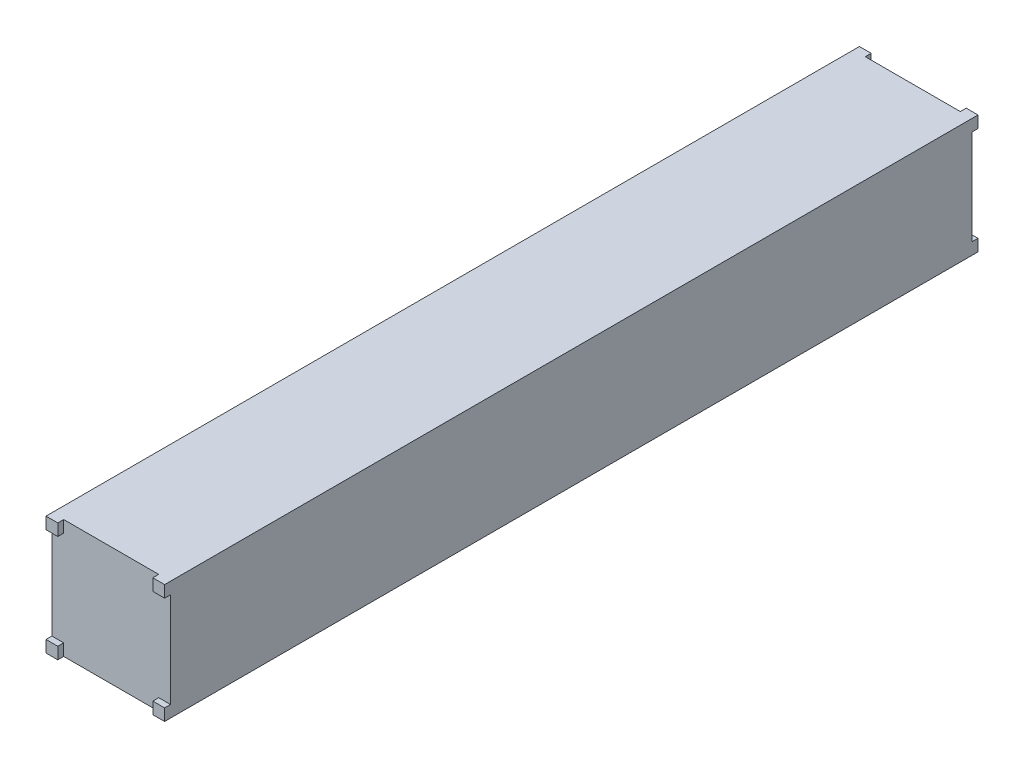
ISO-10303-21;
HEADER;
FILE_DESCRIPTION(('STEP AP214'),'2;1');
FILE_NAME('part.step','',(''),(''),'','','');
FILE_SCHEMA(('AUTOMOTIVE_DESIGN { 1 0 10303 214 1 1 1 1 }'));
ENDSEC;
DATA;
#1=APPLICATION_CONTEXT('core data for automotive mechanical design processes');
#2=APPLICATION_PROTOCOL_DEFINITION('international standard','automotive_design',2000,#1);
#3=PRODUCT_CONTEXT('',#1,'mechanical');
#4=PRODUCT('Part','Part','',(#3));
#5=PRODUCT_RELATED_PRODUCT_CATEGORY('part','',(#4));
#6=PRODUCT_DEFINITION_FORMATION('','',#4);
#7=PRODUCT_DEFINITION_CONTEXT('part definition',#1,'design');
#8=PRODUCT_DEFINITION('design','',#6,#7);
#9=PRODUCT_DEFINITION_SHAPE('','',#8);
#10=(LENGTH_UNIT() NAMED_UNIT(*) SI_UNIT(.MILLI.,.METRE.));
#11=(NAMED_UNIT(*) PLANE_ANGLE_UNIT() SI_UNIT($,.RADIAN.));
#12=(NAMED_UNIT(*) SI_UNIT($,.STERADIAN.) SOLID_ANGLE_UNIT());
#13=UNCERTAINTY_MEASURE_WITH_UNIT(LENGTH_MEASURE(1.E-05),#10,'distance_accuracy_value','');
#14=(GEOMETRIC_REPRESENTATION_CONTEXT(3) GLOBAL_UNCERTAINTY_ASSIGNED_CONTEXT((#13)) GLOBAL_UNIT_ASSIGNED_CONTEXT((#10,
#11,#12)) REPRESENTATION_CONTEXT('',''));
#15=CARTESIAN_POINT('',(0.,0.,0.));
#16=DIRECTION('',(0.,0.,1.));
#17=DIRECTION('',(1.,0.,0.));
#18=AXIS2_PLACEMENT_3D('',#15,#16,#17);
#19=CARTESIAN_POINT('',(0.,0.,-340.));
#20=DIRECTION('',(0.,0.,1.));
#21=DIRECTION('',(1.,0.,0.));
#22=AXIS2_PLACEMENT_3D('',#19,#20,#21);
#23=PLANE('',#22);
#24=DIRECTION('',(0.,1.,0.));
#25=VECTOR('',#24,1.);
#26=CARTESIAN_POINT('',(40.3,-50.3,-340.));
#27=LINE('',#26,#25);
#28=CARTESIAN_POINT('',(40.3,-50.3,-340.));
#29=VERTEX_POINT('',#28);
#30=CARTESIAN_POINT('',(40.3,-40.3,-340.));
#31=VERTEX_POINT('',#30);
#32=EDGE_CURVE('E240',#29,#31,#27,.T.);
#33=ORIENTED_EDGE('',*,*,#32,.F.);
#34=DIRECTION('',(1.,0.,0.));
#35=VECTOR('',#34,1.);
#36=CARTESIAN_POINT('',(50.3,-50.3,-340.));
#37=LINE('',#36,#35);
#38=CARTESIAN_POINT('',(-40.2999999999999,-50.3,-340.));
#39=VERTEX_POINT('',#38);
#40=EDGE_CURVE('E422',#39,#29,#37,.T.);
#41=ORIENTED_EDGE('',*,*,#40,.F.);
#42=DIRECTION('',(0.,-1.,0.));
#43=VECTOR('',#42,1.);
#44=CARTESIAN_POINT('',(-40.3,-50.3,-340.));
#45=LINE('',#44,#43);
#46=CARTESIAN_POINT('',(-40.3,-40.3000000000001,-340.));
#47=VERTEX_POINT('',#46);
#48=EDGE_CURVE('E256',#47,#39,#45,.T.);
#49=ORIENTED_EDGE('',*,*,#48,.F.);
#50=DIRECTION('',(1.,0.,0.));
#51=VECTOR('',#50,1.);
#52=CARTESIAN_POINT('',(-50.3,-40.3000000000001,-340.));
#53=LINE('',#52,#51);
#54=CARTESIAN_POINT('',(-50.3,-40.3000000000001,-340.));
#55=VERTEX_POINT('',#54);
#56=EDGE_CURVE('E251',#55,#47,#53,.T.);
#57=ORIENTED_EDGE('',*,*,#56,.F.);
#58=DIRECTION('',(0.,-1.,0.));
#59=VECTOR('',#58,1.);
#60=CARTESIAN_POINT('',(-50.3,-50.3,-340.));
#61=LINE('',#60,#59);
#62=CARTESIAN_POINT('',(-50.3,40.3000000000001,-340.));
#63=VERTEX_POINT('',#62);
#64=EDGE_CURVE('E409',#63,#55,#61,.T.);
#65=ORIENTED_EDGE('',*,*,#64,.F.);
#66=DIRECTION('',(-1.,0.,0.));
#67=VECTOR('',#66,1.);
#68=CARTESIAN_POINT('',(-50.3,40.3000000000001,-340.));
#69=LINE('',#68,#67);
#70=CARTESIAN_POINT('',(-40.3,40.3000000000001,-340.));
#71=VERTEX_POINT('',#70);
#72=EDGE_CURVE('E275',#71,#63,#69,.T.);
#73=ORIENTED_EDGE('',*,*,#72,.F.);
#74=DIRECTION('',(0.,-1.,0.));
#75=VECTOR('',#74,1.);
#76=CARTESIAN_POINT('',(-40.2999999999999,50.3000000000001,-340.));
#77=LINE('',#76,#75);
#78=CARTESIAN_POINT('',(-40.2999999999999,50.3000000000001,-340.));
#79=VERTEX_POINT('',#78);
#80=EDGE_CURVE('E270',#79,#71,#77,.T.);
#81=ORIENTED_EDGE('',*,*,#80,.F.);
#82=DIRECTION('',(-1.,0.,0.));
#83=VECTOR('',#82,1.);
#84=CARTESIAN_POINT('',(50.3,50.3,-340.));
#85=LINE('',#84,#83);
#86=CARTESIAN_POINT('',(40.3,50.3,-340.));
#87=VERTEX_POINT('',#86);
#88=EDGE_CURVE('E413',#87,#79,#85,.T.);
#89=ORIENTED_EDGE('',*,*,#88,.F.);
#90=DIRECTION('',(0.,1.,0.));
#91=VECTOR('',#90,1.);
#92=CARTESIAN_POINT('',(40.3,50.3,-340.));
#93=LINE('',#92,#91);
#94=CARTESIAN_POINT('',(40.3,40.3,-340.));
#95=VERTEX_POINT('',#94);
#96=EDGE_CURVE('E296',#95,#87,#93,.T.);
#97=ORIENTED_EDGE('',*,*,#96,.F.);
#98=DIRECTION('',(-1.,0.,0.));
#99=VECTOR('',#98,1.);
#100=CARTESIAN_POINT('',(50.3,40.3,-340.));
#101=LINE('',#100,#99);
#102=CARTESIAN_POINT('',(50.3,40.3,-340.));
#103=VERTEX_POINT('',#102);
#104=EDGE_CURVE('E291',#103,#95,#101,.T.);
#105=ORIENTED_EDGE('',*,*,#104,.F.);
#106=DIRECTION('',(0.,1.,0.));
#107=VECTOR('',#106,1.);
#108=CARTESIAN_POINT('',(50.3,-50.3,-340.));
#109=LINE('',#108,#107);
#110=CARTESIAN_POINT('',(50.3,-40.3,-340.));
#111=VERTEX_POINT('',#110);
#112=EDGE_CURVE('E424',#111,#103,#109,.T.);
#113=ORIENTED_EDGE('',*,*,#112,.F.);
#114=DIRECTION('',(1.,0.,0.));
#115=VECTOR('',#114,1.);
#116=CARTESIAN_POINT('',(50.3,-40.3,-340.));
#117=LINE('',#116,#115);
#118=EDGE_CURVE('E238',#31,#111,#117,.T.);
#119=ORIENTED_EDGE('',*,*,#118,.F.);
#120=EDGE_LOOP('',(#33,#41,#49,#57,#65,#73,#81,#89,#97,#105,#113,#119));
#121=FACE_BOUND('',#120,.T.);
#122=ADVANCED_FACE('F33',(#121),#23,.F.);
#123=CARTESIAN_POINT('',(0.,0.,340.));
#124=DIRECTION('',(0.,0.,1.));
#125=DIRECTION('',(1.,0.,0.));
#126=AXIS2_PLACEMENT_3D('',#123,#124,#125);
#127=PLANE('',#126);
#128=DIRECTION('',(-1.,0.,0.));
#129=VECTOR('',#128,1.);
#130=CARTESIAN_POINT('',(-50.3,-40.3,340.));
#131=LINE('',#130,#129);
#132=CARTESIAN_POINT('',(-40.3,-40.3,340.));
#133=VERTEX_POINT('',#132);
#134=CARTESIAN_POINT('',(-50.3,-40.3,340.));
#135=VERTEX_POINT('',#134);
#136=EDGE_CURVE('E321',#133,#135,#131,.T.);
#137=ORIENTED_EDGE('',*,*,#136,.F.);
#138=DIRECTION('',(0.,1.,0.));
#139=VECTOR('',#138,1.);
#140=CARTESIAN_POINT('',(-40.3,-50.3,340.));
#141=LINE('',#140,#139);
#142=CARTESIAN_POINT('',(-40.3,-50.3,340.));
#143=VERTEX_POINT('',#142);
#144=EDGE_CURVE('E316',#143,#133,#141,.T.);
#145=ORIENTED_EDGE('',*,*,#144,.F.);
#146=DIRECTION('',(1.,0.,0.));
#147=VECTOR('',#146,1.);
#148=CARTESIAN_POINT('',(50.3,-50.3,340.));
#149=LINE('',#148,#147);
#150=CARTESIAN_POINT('',(40.3,-50.3,340.));
#151=VERTEX_POINT('',#150);
#152=EDGE_CURVE('E412',#143,#151,#149,.T.);
#153=ORIENTED_EDGE('',*,*,#152,.T.);
#154=DIRECTION('',(0.,-1.,0.));
#155=VECTOR('',#154,1.);
#156=CARTESIAN_POINT('',(40.3,-50.3,340.));
#157=LINE('',#156,#155);
#158=CARTESIAN_POINT('',(40.3,-40.3,340.));
#159=VERTEX_POINT('',#158);
#160=EDGE_CURVE('E343',#159,#151,#157,.T.);
#161=ORIENTED_EDGE('',*,*,#160,.F.);
#162=DIRECTION('',(-1.,0.,0.));
#163=VECTOR('',#162,1.);
#164=CARTESIAN_POINT('',(50.3,-40.3,340.));
#165=LINE('',#164,#163);
#166=CARTESIAN_POINT('',(50.3,-40.3,340.));
#167=VERTEX_POINT('',#166);
#168=EDGE_CURVE('E340',#167,#159,#165,.T.);
#169=ORIENTED_EDGE('',*,*,#168,.F.);
#170=DIRECTION('',(0.,1.,0.));
#171=VECTOR('',#170,1.);
#172=CARTESIAN_POINT('',(50.3,-50.3,340.));
#173=LINE('',#172,#171);
#174=CARTESIAN_POINT('',(50.3,40.3,340.));
#175=VERTEX_POINT('',#174);
#176=EDGE_CURVE('E415',#167,#175,#173,.T.);
#177=ORIENTED_EDGE('',*,*,#176,.T.);
#178=DIRECTION('',(1.,0.,0.));
#179=VECTOR('',#178,1.);
#180=CARTESIAN_POINT('',(50.3,40.3,340.));
#181=LINE('',#180,#179);
#182=CARTESIAN_POINT('',(40.3,40.3,340.));
#183=VERTEX_POINT('',#182);
#184=EDGE_CURVE('E367',#183,#175,#181,.T.);
#185=ORIENTED_EDGE('',*,*,#184,.F.);
#186=DIRECTION('',(0.,-1.,0.));
#187=VECTOR('',#186,1.);
#188=CARTESIAN_POINT('',(40.3,50.3,340.));
#189=LINE('',#188,#187);
#190=CARTESIAN_POINT('',(40.3,50.3,340.));
#191=VERTEX_POINT('',#190);
#192=EDGE_CURVE('E362',#191,#183,#189,.T.);
#193=ORIENTED_EDGE('',*,*,#192,.F.);
#194=DIRECTION('',(-1.,0.,0.));
#195=VECTOR('',#194,1.);
#196=CARTESIAN_POINT('',(50.3,50.3,340.));
#197=LINE('',#196,#195);
#198=CARTESIAN_POINT('',(-40.2999999999999,50.3,340.));
#199=VERTEX_POINT('',#198);
#200=EDGE_CURVE('E417',#191,#199,#197,.T.);
#201=ORIENTED_EDGE('',*,*,#200,.T.);
#202=DIRECTION('',(0.,1.,0.));
#203=VECTOR('',#202,1.);
#204=CARTESIAN_POINT('',(-40.3,50.3,340.));
#205=LINE('',#204,#203);
#206=CARTESIAN_POINT('',(-40.3,40.3,340.));
#207=VERTEX_POINT('',#206);
#208=EDGE_CURVE('E389',#207,#199,#205,.T.);
#209=ORIENTED_EDGE('',*,*,#208,.F.);
#210=DIRECTION('',(1.,0.,0.));
#211=VECTOR('',#210,1.);
#212=CARTESIAN_POINT('',(-50.3,40.3,340.));
#213=LINE('',#212,#211);
#214=CARTESIAN_POINT('',(-50.3,40.3,340.));
#215=VERTEX_POINT('',#214);
#216=EDGE_CURVE('E384',#215,#207,#213,.T.);
#217=ORIENTED_EDGE('',*,*,#216,.F.);
#218=DIRECTION('',(0.,-1.,0.));
#219=VECTOR('',#218,1.);
#220=CARTESIAN_POINT('',(-50.3,-50.3,340.));
#221=LINE('',#220,#219);
#222=EDGE_CURVE('E410',#215,#135,#221,.T.);
#223=ORIENTED_EDGE('',*,*,#222,.T.);
#224=EDGE_LOOP('',(#137,#145,#153,#161,#169,#177,#185,#193,#201,#209,#217,#223));
#225=FACE_BOUND('',#224,.T.);
#226=ADVANCED_FACE('F484',(#225),#127,.T.);
#227=CARTESIAN_POINT('',(-50.3,-50.3,340.));
#228=DIRECTION('',(1.,0.,0.));
#229=DIRECTION('',(0.,0.,-1.));
#230=AXIS2_PLACEMENT_3D('',#227,#228,#229);
#231=PLANE('',#230);
#232=DIRECTION('',(0.,0.,-1.));
#233=VECTOR('',#232,1.);
#234=CARTESIAN_POINT('',(-50.3,50.3,340.));
#235=LINE('',#234,#233);
#236=CARTESIAN_POINT('',(-50.3,50.3,345.));
#237=VERTEX_POINT('',#236);
#238=CARTESIAN_POINT('',(-50.2999999999999,50.3000000000001,-345.));
#239=VERTEX_POINT('',#238);
#240=EDGE_CURVE('E419',#237,#239,#235,.T.);
#241=ORIENTED_EDGE('',*,*,#240,.T.);
#242=DIRECTION('',(0.,1.,0.));
#243=VECTOR('',#242,1.);
#244=CARTESIAN_POINT('',(-50.2999999999999,50.3000000000001,-345.));
#245=LINE('',#244,#243);
#246=CARTESIAN_POINT('',(-50.3,40.3000000000001,-345.));
#247=VERTEX_POINT('',#246);
#248=EDGE_CURVE('E271',#247,#239,#245,.T.);
#249=ORIENTED_EDGE('',*,*,#248,.F.);
#250=DIRECTION('',(0.,0.,1.));
#251=VECTOR('',#250,1.);
#252=CARTESIAN_POINT('',(-50.3,40.3000000000001,-345.));
#253=LINE('',#252,#251);
#254=EDGE_CURVE('E281',#247,#63,#253,.T.);
#255=ORIENTED_EDGE('',*,*,#254,.T.);
#256=ORIENTED_EDGE('',*,*,#64,.T.);
#257=DIRECTION('',(0.,0.,1.));
#258=VECTOR('',#257,1.);
#259=CARTESIAN_POINT('',(-50.3,-40.3000000000001,-345.));
#260=LINE('',#259,#258);
#261=CARTESIAN_POINT('',(-50.3,-40.3000000000001,-345.));
#262=VERTEX_POINT('',#261);
#263=EDGE_CURVE('E268',#262,#55,#260,.T.);
#264=ORIENTED_EDGE('',*,*,#263,.F.);
#265=DIRECTION('',(0.,1.,0.));
#266=VECTOR('',#265,1.);
#267=CARTESIAN_POINT('',(-50.3,-50.3000000000001,-345.));
#268=LINE('',#267,#266);
#269=CARTESIAN_POINT('',(-50.3,-50.3000000000001,-345.));
#270=VERTEX_POINT('',#269);
#271=EDGE_CURVE('E255',#270,#262,#268,.T.);
#272=ORIENTED_EDGE('',*,*,#271,.F.);
#273=DIRECTION('',(0.,0.,-1.));
#274=VECTOR('',#273,1.);
#275=CARTESIAN_POINT('',(-50.3,-50.3,340.));
#276=LINE('',#275,#274);
#277=CARTESIAN_POINT('',(-50.3,-50.3,345.));
#278=VERTEX_POINT('',#277);
#279=EDGE_CURVE('E11',#278,#270,#276,.T.);
#280=ORIENTED_EDGE('',*,*,#279,.F.);
#281=DIRECTION('',(0.,-1.,0.));
#282=VECTOR('',#281,1.);
#283=CARTESIAN_POINT('',(-50.3,-50.3,345.));
#284=LINE('',#283,#282);
#285=CARTESIAN_POINT('',(-50.3,-40.3,345.));
#286=VERTEX_POINT('',#285);
#287=EDGE_CURVE('E317',#286,#278,#284,.T.);
#288=ORIENTED_EDGE('',*,*,#287,.F.);
#289=DIRECTION('',(0.,0.,-1.));
#290=VECTOR('',#289,1.);
#291=CARTESIAN_POINT('',(-50.3,-40.3,345.));
#292=LINE('',#291,#290);
#293=EDGE_CURVE('E327',#286,#135,#292,.T.);
#294=ORIENTED_EDGE('',*,*,#293,.T.);
#295=ORIENTED_EDGE('',*,*,#222,.F.);
#296=DIRECTION('',(0.,0.,-1.));
#297=VECTOR('',#296,1.);
#298=CARTESIAN_POINT('',(-50.3,40.3,345.));
#299=LINE('',#298,#297);
#300=CARTESIAN_POINT('',(-50.3,40.3,345.));
#301=VERTEX_POINT('',#300);
#302=EDGE_CURVE('E406',#301,#215,#299,.T.);
#303=ORIENTED_EDGE('',*,*,#302,.F.);
#304=DIRECTION('',(0.,-1.,0.));
#305=VECTOR('',#304,1.);
#306=CARTESIAN_POINT('',(-50.3,50.3,345.));
#307=LINE('',#306,#305);
#308=EDGE_CURVE('E385',#237,#301,#307,.T.);
#309=ORIENTED_EDGE('',*,*,#308,.F.);
#310=EDGE_LOOP('',(#241,#249,#255,#256,#264,#272,#280,#288,#294,#295,#303,#309));
#311=FACE_BOUND('',#310,.T.);
#312=ADVANCED_FACE('F35',(#311),#231,.F.);
#313=CARTESIAN_POINT('',(50.3,-50.3,340.));
#314=DIRECTION('',(0.,1.,0.));
#315=DIRECTION('',(0.,0.,1.));
#316=AXIS2_PLACEMENT_3D('',#313,#314,#315);
#317=PLANE('',#316);
#318=ORIENTED_EDGE('',*,*,#279,.T.);
#319=DIRECTION('',(-1.,0.,0.));
#320=VECTOR('',#319,1.);
#321=CARTESIAN_POINT('',(-50.3,-50.3000000000001,-345.));
#322=LINE('',#321,#320);
#323=CARTESIAN_POINT('',(-40.3,-50.3,-345.));
#324=VERTEX_POINT('',#323);
#325=EDGE_CURVE('E252',#324,#270,#322,.T.);
#326=ORIENTED_EDGE('',*,*,#325,.F.);
#327=DIRECTION('',(0.,0.,1.));
#328=VECTOR('',#327,1.);
#329=CARTESIAN_POINT('',(-40.3,-50.3,-345.));
#330=LINE('',#329,#328);
#331=EDGE_CURVE('E56',#324,#39,#330,.T.);
#332=ORIENTED_EDGE('',*,*,#331,.T.);
#333=ORIENTED_EDGE('',*,*,#40,.T.);
#334=DIRECTION('',(0.,0.,1.));
#335=VECTOR('',#334,1.);
#336=CARTESIAN_POINT('',(40.3,-50.3,-345.));
#337=LINE('',#336,#335);
#338=CARTESIAN_POINT('',(40.3,-50.3,-345.));
#339=VERTEX_POINT('',#338);
#340=EDGE_CURVE('E230',#339,#29,#337,.T.);
#341=ORIENTED_EDGE('',*,*,#340,.F.);
#342=DIRECTION('',(-1.,0.,0.));
#343=VECTOR('',#342,1.);
#344=CARTESIAN_POINT('',(50.3,-50.3,-345.));
#345=LINE('',#344,#343);
#346=CARTESIAN_POINT('',(50.3,-50.3,-345.));
#347=VERTEX_POINT('',#346);
#348=EDGE_CURVE('E228',#347,#339,#345,.T.);
#349=ORIENTED_EDGE('',*,*,#348,.F.);
#350=DIRECTION('',(0.,0.,-1.));
#351=VECTOR('',#350,1.);
#352=CARTESIAN_POINT('',(50.3,-50.3,340.));
#353=LINE('',#352,#351);
#354=CARTESIAN_POINT('',(50.3,-50.3,345.));
#355=VERTEX_POINT('',#354);
#356=EDGE_CURVE('E41',#355,#347,#353,.T.);
#357=ORIENTED_EDGE('',*,*,#356,.F.);
#358=DIRECTION('',(1.,0.,0.));
#359=VECTOR('',#358,1.);
#360=CARTESIAN_POINT('',(50.3,-50.3,345.));
#361=LINE('',#360,#359);
#362=CARTESIAN_POINT('',(40.3,-50.3,345.));
#363=VERTEX_POINT('',#362);
#364=EDGE_CURVE('E341',#363,#355,#361,.T.);
#365=ORIENTED_EDGE('',*,*,#364,.F.);
#366=DIRECTION('',(0.,0.,-1.));
#367=VECTOR('',#366,1.);
#368=CARTESIAN_POINT('',(40.3,-50.3,345.));
#369=LINE('',#368,#367);
#370=EDGE_CURVE('E349',#363,#151,#369,.T.);
#371=ORIENTED_EDGE('',*,*,#370,.T.);
#372=ORIENTED_EDGE('',*,*,#152,.F.);
#373=DIRECTION('',(0.,0.,-1.));
#374=VECTOR('',#373,1.);
#375=CARTESIAN_POINT('',(-40.3,-50.3,345.));
#376=LINE('',#375,#374);
#377=CARTESIAN_POINT('',(-40.3,-50.3,345.));
#378=VERTEX_POINT('',#377);
#379=EDGE_CURVE('E337',#378,#143,#376,.T.);
#380=ORIENTED_EDGE('',*,*,#379,.F.);
#381=DIRECTION('',(1.,0.,0.));
#382=VECTOR('',#381,1.);
#383=CARTESIAN_POINT('',(-50.3,-50.3,345.));
#384=LINE('',#383,#382);
#385=EDGE_CURVE('E320',#278,#378,#384,.T.);
#386=ORIENTED_EDGE('',*,*,#385,.F.);
#387=EDGE_LOOP('',(#318,#326,#332,#333,#341,#349,#357,#365,#371,#372,#380,#386));
#388=FACE_BOUND('',#387,.T.);
#389=ADVANCED_FACE('F229',(#388),#317,.F.);
#390=CARTESIAN_POINT('',(50.3,-50.3,340.));
#391=DIRECTION('',(-1.,0.,0.));
#392=DIRECTION('',(0.,0.,1.));
#393=AXIS2_PLACEMENT_3D('',#390,#391,#392);
#394=PLANE('',#393);
#395=ORIENTED_EDGE('',*,*,#356,.T.);
#396=DIRECTION('',(0.,-1.,0.));
#397=VECTOR('',#396,1.);
#398=CARTESIAN_POINT('',(50.3,-50.3,-345.));
#399=LINE('',#398,#397);
#400=CARTESIAN_POINT('',(50.3,-40.3,-345.));
#401=VERTEX_POINT('',#400);
#402=EDGE_CURVE('E221',#401,#347,#399,.T.);
#403=ORIENTED_EDGE('',*,*,#402,.F.);
#404=DIRECTION('',(0.,0.,1.));
#405=VECTOR('',#404,1.);
#406=CARTESIAN_POINT('',(50.3,-40.3,-345.));
#407=LINE('',#406,#405);
#408=EDGE_CURVE('E48',#401,#111,#407,.T.);
#409=ORIENTED_EDGE('',*,*,#408,.T.);
#410=ORIENTED_EDGE('',*,*,#112,.T.);
#411=DIRECTION('',(0.,0.,1.));
#412=VECTOR('',#411,1.);
#413=CARTESIAN_POINT('',(50.3,40.3,-345.));
#414=LINE('',#413,#412);
#415=CARTESIAN_POINT('',(50.3,40.3,-345.));
#416=VERTEX_POINT('',#415);
#417=EDGE_CURVE('E313',#416,#103,#414,.T.);
#418=ORIENTED_EDGE('',*,*,#417,.F.);
#419=DIRECTION('',(0.,-1.,0.));
#420=VECTOR('',#419,1.);
#421=CARTESIAN_POINT('',(50.3,50.3,-345.));
#422=LINE('',#421,#420);
#423=CARTESIAN_POINT('',(50.3,50.3,-345.));
#424=VERTEX_POINT('',#423);
#425=EDGE_CURVE('E292',#424,#416,#422,.T.);
#426=ORIENTED_EDGE('',*,*,#425,.F.);
#427=DIRECTION('',(0.,0.,-1.));
#428=VECTOR('',#427,1.);
#429=CARTESIAN_POINT('',(50.3,50.3,340.));
#430=LINE('',#429,#428);
#431=CARTESIAN_POINT('',(50.3,50.3,345.));
#432=VERTEX_POINT('',#431);
#433=EDGE_CURVE('E226',#432,#424,#430,.T.);
#434=ORIENTED_EDGE('',*,*,#433,.F.);
#435=DIRECTION('',(0.,1.,0.));
#436=VECTOR('',#435,1.);
#437=CARTESIAN_POINT('',(50.3,50.3,345.));
#438=LINE('',#437,#436);
#439=CARTESIAN_POINT('',(50.3,40.3,345.));
#440=VERTEX_POINT('',#439);
#441=EDGE_CURVE('E363',#440,#432,#438,.T.);
#442=ORIENTED_EDGE('',*,*,#441,.F.);
#443=DIRECTION('',(0.,0.,-1.));
#444=VECTOR('',#443,1.);
#445=CARTESIAN_POINT('',(50.3,40.3,345.));
#446=LINE('',#445,#444);
#447=EDGE_CURVE('E373',#440,#175,#446,.T.);
#448=ORIENTED_EDGE('',*,*,#447,.T.);
#449=ORIENTED_EDGE('',*,*,#176,.F.);
#450=DIRECTION('',(0.,0.,-1.));
#451=VECTOR('',#450,1.);
#452=CARTESIAN_POINT('',(50.3,-40.3,345.));
#453=LINE('',#452,#451);
#454=CARTESIAN_POINT('',(50.3,-40.3,345.));
#455=VERTEX_POINT('',#454);
#456=EDGE_CURVE('E359',#455,#167,#453,.T.);
#457=ORIENTED_EDGE('',*,*,#456,.F.);
#458=DIRECTION('',(0.,1.,0.));
#459=VECTOR('',#458,1.);
#460=CARTESIAN_POINT('',(50.3,-50.3,345.));
#461=LINE('',#460,#459);
#462=EDGE_CURVE('E223',#355,#455,#461,.T.);
#463=ORIENTED_EDGE('',*,*,#462,.F.);
#464=EDGE_LOOP('',(#395,#403,#409,#410,#418,#426,#434,#442,#448,#449,#457,#463));
#465=FACE_BOUND('',#464,.T.);
#466=ADVANCED_FACE('F219',(#465),#394,.F.);
#467=CARTESIAN_POINT('',(50.3,50.3,340.));
#468=DIRECTION('',(0.,-1.,0.));
#469=DIRECTION('',(1.,0.,0.));
#470=AXIS2_PLACEMENT_3D('',#467,#468,#469);
#471=PLANE('',#470);
#472=ORIENTED_EDGE('',*,*,#433,.T.);
#473=DIRECTION('',(1.,0.,0.));
#474=VECTOR('',#473,1.);
#475=CARTESIAN_POINT('',(50.3,50.3,-345.));
#476=LINE('',#475,#474);
#477=CARTESIAN_POINT('',(40.3,50.3,-345.));
#478=VERTEX_POINT('',#477);
#479=EDGE_CURVE('E300',#478,#424,#476,.T.);
#480=ORIENTED_EDGE('',*,*,#479,.F.);
#481=DIRECTION('',(0.,0.,1.));
#482=VECTOR('',#481,1.);
#483=CARTESIAN_POINT('',(40.3,50.3,-345.));
#484=LINE('',#483,#482);
#485=EDGE_CURVE('E303',#478,#87,#484,.T.);
#486=ORIENTED_EDGE('',*,*,#485,.T.);
#487=ORIENTED_EDGE('',*,*,#88,.T.);
#488=DIRECTION('',(0.,0.,1.));
#489=VECTOR('',#488,1.);
#490=CARTESIAN_POINT('',(-40.2999999999999,50.3000000000001,-345.));
#491=LINE('',#490,#489);
#492=CARTESIAN_POINT('',(-40.2999999999999,50.3000000000001,-345.));
#493=VERTEX_POINT('',#492);
#494=EDGE_CURVE('E289',#493,#79,#491,.T.);
#495=ORIENTED_EDGE('',*,*,#494,.F.);
#496=DIRECTION('',(1.,0.,0.));
#497=VECTOR('',#496,1.);
#498=CARTESIAN_POINT('',(-50.2999999999999,50.3000000000001,-345.));
#499=LINE('',#498,#497);
#500=EDGE_CURVE('E274',#239,#493,#499,.T.);
#501=ORIENTED_EDGE('',*,*,#500,.F.);
#502=ORIENTED_EDGE('',*,*,#240,.F.);
#503=DIRECTION('',(-1.,0.,0.));
#504=VECTOR('',#503,1.);
#505=CARTESIAN_POINT('',(-50.3,50.3,345.));
#506=LINE('',#505,#504);
#507=CARTESIAN_POINT('',(-40.3,50.3,345.));
#508=VERTEX_POINT('',#507);
#509=EDGE_CURVE('E393',#508,#237,#506,.T.);
#510=ORIENTED_EDGE('',*,*,#509,.F.);
#511=DIRECTION('',(0.,0.,-1.));
#512=VECTOR('',#511,1.);
#513=CARTESIAN_POINT('',(-40.3,50.3,345.));
#514=LINE('',#513,#512);
#515=EDGE_CURVE('E396',#508,#199,#514,.T.);
#516=ORIENTED_EDGE('',*,*,#515,.T.);
#517=ORIENTED_EDGE('',*,*,#200,.F.);
#518=DIRECTION('',(0.,0.,-1.));
#519=VECTOR('',#518,1.);
#520=CARTESIAN_POINT('',(40.3,50.3,345.));
#521=LINE('',#520,#519);
#522=CARTESIAN_POINT('',(40.3,50.3,345.));
#523=VERTEX_POINT('',#522);
#524=EDGE_CURVE('E382',#523,#191,#521,.T.);
#525=ORIENTED_EDGE('',*,*,#524,.F.);
#526=DIRECTION('',(-1.,0.,0.));
#527=VECTOR('',#526,1.);
#528=CARTESIAN_POINT('',(50.3,50.3,345.));
#529=LINE('',#528,#527);
#530=EDGE_CURVE('E366',#432,#523,#529,.T.);
#531=ORIENTED_EDGE('',*,*,#530,.F.);
#532=EDGE_LOOP('',(#472,#480,#486,#487,#495,#501,#502,#510,#516,#517,#525,#531));
#533=FACE_BOUND('',#532,.T.);
#534=ADVANCED_FACE('F432',(#533),#471,.F.);
#535=CARTESIAN_POINT('',(-50.3,40.3,345.));
#536=DIRECTION('',(0.,1.,0.));
#537=DIRECTION('',(0.,0.,1.));
#538=AXIS2_PLACEMENT_3D('',#535,#536,#537);
#539=PLANE('',#538);
#540=ORIENTED_EDGE('',*,*,#216,.T.);
#541=DIRECTION('',(0.,0.,-1.));
#542=VECTOR('',#541,1.);
#543=CARTESIAN_POINT('',(-40.3,40.3,345.));
#544=LINE('',#543,#542);
#545=CARTESIAN_POINT('',(-40.3,40.3,345.));
#546=VERTEX_POINT('',#545);
#547=EDGE_CURVE('E403',#546,#207,#544,.T.);
#548=ORIENTED_EDGE('',*,*,#547,.F.);
#549=DIRECTION('',(1.,0.,0.));
#550=VECTOR('',#549,1.);
#551=CARTESIAN_POINT('',(-50.3,40.3,345.));
#552=LINE('',#551,#550);
#553=EDGE_CURVE('E388',#301,#546,#552,.T.);
#554=ORIENTED_EDGE('',*,*,#553,.F.);
#555=ORIENTED_EDGE('',*,*,#302,.T.);
#556=EDGE_LOOP('',(#540,#548,#554,#555));
#557=FACE_BOUND('',#556,.T.);
#558=ADVANCED_FACE('F476',(#557),#539,.F.);
#559=CARTESIAN_POINT('',(-40.3,50.3,345.));
#560=DIRECTION('',(-1.,0.,0.));
#561=DIRECTION('',(0.,0.,1.));
#562=AXIS2_PLACEMENT_3D('',#559,#560,#561);
#563=PLANE('',#562);
#564=ORIENTED_EDGE('',*,*,#208,.T.);
#565=ORIENTED_EDGE('',*,*,#515,.F.);
#566=DIRECTION('',(0.,1.,0.));
#567=VECTOR('',#566,1.);
#568=CARTESIAN_POINT('',(-40.3,50.3,345.));
#569=LINE('',#568,#567);
#570=EDGE_CURVE('E391',#546,#508,#569,.T.);
#571=ORIENTED_EDGE('',*,*,#570,.F.);
#572=ORIENTED_EDGE('',*,*,#547,.T.);
#573=EDGE_LOOP('',(#564,#565,#571,#572));
#574=FACE_BOUND('',#573,.T.);
#575=ADVANCED_FACE('F479',(#574),#563,.F.);
#576=CARTESIAN_POINT('',(0.,0.,345.));
#577=DIRECTION('',(0.,0.,1.));
#578=DIRECTION('',(1.,0.,0.));
#579=AXIS2_PLACEMENT_3D('',#576,#577,#578);
#580=PLANE('',#579);
#581=ORIENTED_EDGE('',*,*,#308,.T.);
#582=ORIENTED_EDGE('',*,*,#553,.T.);
#583=ORIENTED_EDGE('',*,*,#570,.T.);
#584=ORIENTED_EDGE('',*,*,#509,.T.);
#585=EDGE_LOOP('',(#581,#582,#583,#584));
#586=FACE_BOUND('',#585,.T.);
#587=ADVANCED_FACE('F470',(#586),#580,.T.);
#588=CARTESIAN_POINT('',(40.3,50.3,345.));
#589=DIRECTION('',(1.,0.,0.));
#590=DIRECTION('',(0.,0.,-1.));
#591=AXIS2_PLACEMENT_3D('',#588,#589,#590);
#592=PLANE('',#591);
#593=ORIENTED_EDGE('',*,*,#192,.T.);
#594=DIRECTION('',(0.,0.,-1.));
#595=VECTOR('',#594,1.);
#596=CARTESIAN_POINT('',(40.3,40.3,345.));
#597=LINE('',#596,#595);
#598=CARTESIAN_POINT('',(40.3,40.3,345.));
#599=VERTEX_POINT('',#598);
#600=EDGE_CURVE('E380',#599,#183,#597,.T.);
#601=ORIENTED_EDGE('',*,*,#600,.F.);
#602=DIRECTION('',(0.,-1.,0.));
#603=VECTOR('',#602,1.);
#604=CARTESIAN_POINT('',(40.3,50.3,345.));
#605=LINE('',#604,#603);
#606=EDGE_CURVE('E369',#523,#599,#605,.T.);
#607=ORIENTED_EDGE('',*,*,#606,.F.);
#608=ORIENTED_EDGE('',*,*,#524,.T.);
#609=EDGE_LOOP('',(#593,#601,#607,#608));
#610=FACE_BOUND('',#609,.T.);
#611=ADVANCED_FACE('F488',(#610),#592,.F.);
#612=CARTESIAN_POINT('',(50.3,40.3,345.));
#613=DIRECTION('',(0.,1.,0.));
#614=DIRECTION('',(-1.,0.,0.));
#615=AXIS2_PLACEMENT_3D('',#612,#613,#614);
#616=PLANE('',#615);
#617=ORIENTED_EDGE('',*,*,#184,.T.);
#618=ORIENTED_EDGE('',*,*,#447,.F.);
#619=DIRECTION('',(1.,0.,0.));
#620=VECTOR('',#619,1.);
#621=CARTESIAN_POINT('',(50.3,40.3,345.));
#622=LINE('',#621,#620);
#623=EDGE_CURVE('E371',#599,#440,#622,.T.);
#624=ORIENTED_EDGE('',*,*,#623,.F.);
#625=ORIENTED_EDGE('',*,*,#600,.T.);
#626=EDGE_LOOP('',(#617,#618,#624,#625));
#627=FACE_BOUND('',#626,.T.);
#628=ADVANCED_FACE('F495',(#627),#616,.F.);
#629=CARTESIAN_POINT('',(0.,0.,345.));
#630=DIRECTION('',(0.,0.,-1.));
#631=DIRECTION('',(-1.,0.,0.));
#632=AXIS2_PLACEMENT_3D('',#629,#630,#631);
#633=PLANE('',#632);
#634=ORIENTED_EDGE('',*,*,#441,.T.);
#635=ORIENTED_EDGE('',*,*,#530,.T.);
#636=ORIENTED_EDGE('',*,*,#606,.T.);
#637=ORIENTED_EDGE('',*,*,#623,.T.);
#638=EDGE_LOOP('',(#634,#635,#636,#637));
#639=FACE_BOUND('',#638,.T.);
#640=ADVANCED_FACE('F491',(#639),#633,.F.);
#641=CARTESIAN_POINT('',(50.3,-40.3,345.));
#642=DIRECTION('',(0.,-1.,0.));
#643=DIRECTION('',(1.,0.,0.));
#644=AXIS2_PLACEMENT_3D('',#641,#642,#643);
#645=PLANE('',#644);
#646=ORIENTED_EDGE('',*,*,#168,.T.);
#647=DIRECTION('',(0.,0.,-1.));
#648=VECTOR('',#647,1.);
#649=CARTESIAN_POINT('',(40.3,-40.3,345.));
#650=LINE('',#649,#648);
#651=CARTESIAN_POINT('',(40.3,-40.3,345.));
#652=VERTEX_POINT('',#651);
#653=EDGE_CURVE('E356',#652,#159,#650,.T.);
#654=ORIENTED_EDGE('',*,*,#653,.F.);
#655=DIRECTION('',(-1.,0.,0.));
#656=VECTOR('',#655,1.);
#657=CARTESIAN_POINT('',(50.3,-40.3,345.));
#658=LINE('',#657,#656);
#659=EDGE_CURVE('E345',#455,#652,#658,.T.);
#660=ORIENTED_EDGE('',*,*,#659,.F.);
#661=ORIENTED_EDGE('',*,*,#456,.T.);
#662=EDGE_LOOP('',(#646,#654,#660,#661));
#663=FACE_BOUND('',#662,.T.);
#664=ADVANCED_FACE('F502',(#663),#645,.F.);
#665=CARTESIAN_POINT('',(40.3,-50.3,345.));
#666=DIRECTION('',(1.,0.,0.));
#667=DIRECTION('',(0.,0.,-1.));
#668=AXIS2_PLACEMENT_3D('',#665,#666,#667);
#669=PLANE('',#668);
#670=ORIENTED_EDGE('',*,*,#160,.T.);
#671=ORIENTED_EDGE('',*,*,#370,.F.);
#672=DIRECTION('',(0.,-1.,0.));
#673=VECTOR('',#672,1.);
#674=CARTESIAN_POINT('',(40.3,-50.3,345.));
#675=LINE('',#674,#673);
#676=EDGE_CURVE('E347',#652,#363,#675,.T.);
#677=ORIENTED_EDGE('',*,*,#676,.F.);
#678=ORIENTED_EDGE('',*,*,#653,.T.);
#679=EDGE_LOOP('',(#670,#671,#677,#678));
#680=FACE_BOUND('',#679,.T.);
#681=ADVANCED_FACE('F577',(#680),#669,.F.);
#682=CARTESIAN_POINT('',(0.,0.,345.));
#683=DIRECTION('',(0.,0.,-1.));
#684=DIRECTION('',(-1.,0.,0.));
#685=AXIS2_PLACEMENT_3D('',#682,#683,#684);
#686=PLANE('',#685);
#687=ORIENTED_EDGE('',*,*,#364,.T.);
#688=ORIENTED_EDGE('',*,*,#462,.T.);
#689=ORIENTED_EDGE('',*,*,#659,.T.);
#690=ORIENTED_EDGE('',*,*,#676,.T.);
#691=EDGE_LOOP('',(#687,#688,#689,#690));
#692=FACE_BOUND('',#691,.T.);
#693=ADVANCED_FACE('F587',(#692),#686,.F.);
#694=CARTESIAN_POINT('',(-40.3,-50.3,345.));
#695=DIRECTION('',(-1.,0.,0.));
#696=DIRECTION('',(0.,0.,1.));
#697=AXIS2_PLACEMENT_3D('',#694,#695,#696);
#698=PLANE('',#697);
#699=ORIENTED_EDGE('',*,*,#144,.T.);
#700=DIRECTION('',(0.,0.,-1.));
#701=VECTOR('',#700,1.);
#702=CARTESIAN_POINT('',(-40.3,-40.3,345.));
#703=LINE('',#702,#701);
#704=CARTESIAN_POINT('',(-40.3,-40.3,345.));
#705=VERTEX_POINT('',#704);
#706=EDGE_CURVE('E334',#705,#133,#703,.T.);
#707=ORIENTED_EDGE('',*,*,#706,.F.);
#708=DIRECTION('',(0.,1.,0.));
#709=VECTOR('',#708,1.);
#710=CARTESIAN_POINT('',(-40.3,-50.3,345.));
#711=LINE('',#710,#709);
#712=EDGE_CURVE('E323',#378,#705,#711,.T.);
#713=ORIENTED_EDGE('',*,*,#712,.F.);
#714=ORIENTED_EDGE('',*,*,#379,.T.);
#715=EDGE_LOOP('',(#699,#707,#713,#714));
#716=FACE_BOUND('',#715,.T.);
#717=ADVANCED_FACE('F597',(#716),#698,.F.);
#718=CARTESIAN_POINT('',(-50.3,-40.3,345.));
#719=DIRECTION('',(0.,-1.,0.));
#720=DIRECTION('',(0.,0.,-1.));
#721=AXIS2_PLACEMENT_3D('',#718,#719,#720);
#722=PLANE('',#721);
#723=ORIENTED_EDGE('',*,*,#136,.T.);
#724=ORIENTED_EDGE('',*,*,#293,.F.);
#725=DIRECTION('',(-1.,0.,0.));
#726=VECTOR('',#725,1.);
#727=CARTESIAN_POINT('',(-50.3,-40.3,345.));
#728=LINE('',#727,#726);
#729=EDGE_CURVE('E325',#705,#286,#728,.T.);
#730=ORIENTED_EDGE('',*,*,#729,.F.);
#731=ORIENTED_EDGE('',*,*,#706,.T.);
#732=EDGE_LOOP('',(#723,#724,#730,#731));
#733=FACE_BOUND('',#732,.T.);
#734=ADVANCED_FACE('F607',(#733),#722,.F.);
#735=CARTESIAN_POINT('',(0.,0.,345.));
#736=DIRECTION('',(0.,0.,-1.));
#737=DIRECTION('',(-1.,0.,0.));
#738=AXIS2_PLACEMENT_3D('',#735,#736,#737);
#739=PLANE('',#738);
#740=ORIENTED_EDGE('',*,*,#287,.T.);
#741=ORIENTED_EDGE('',*,*,#385,.T.);
#742=ORIENTED_EDGE('',*,*,#712,.T.);
#743=ORIENTED_EDGE('',*,*,#729,.T.);
#744=EDGE_LOOP('',(#740,#741,#742,#743));
#745=FACE_BOUND('',#744,.T.);
#746=ADVANCED_FACE('F617',(#745),#739,.F.);
#747=CARTESIAN_POINT('',(50.3,40.3,-345.));
#748=DIRECTION('',(0.,1.,0.));
#749=DIRECTION('',(0.,0.,1.));
#750=AXIS2_PLACEMENT_3D('',#747,#748,#749);
#751=PLANE('',#750);
#752=ORIENTED_EDGE('',*,*,#104,.T.);
#753=DIRECTION('',(0.,0.,1.));
#754=VECTOR('',#753,1.);
#755=CARTESIAN_POINT('',(40.3,40.3,-345.));
#756=LINE('',#755,#754);
#757=CARTESIAN_POINT('',(40.3,40.3,-345.));
#758=VERTEX_POINT('',#757);
#759=EDGE_CURVE('E310',#758,#95,#756,.T.);
#760=ORIENTED_EDGE('',*,*,#759,.F.);
#761=DIRECTION('',(-1.,0.,0.));
#762=VECTOR('',#761,1.);
#763=CARTESIAN_POINT('',(50.3,40.3,-345.));
#764=LINE('',#763,#762);
#765=EDGE_CURVE('E295',#416,#758,#764,.T.);
#766=ORIENTED_EDGE('',*,*,#765,.F.);
#767=ORIENTED_EDGE('',*,*,#417,.T.);
#768=EDGE_LOOP('',(#752,#760,#766,#767));
#769=FACE_BOUND('',#768,.T.);
#770=ADVANCED_FACE('F444',(#769),#751,.F.);
#771=CARTESIAN_POINT('',(40.3,50.3,-345.));
#772=DIRECTION('',(1.,0.,0.));
#773=DIRECTION('',(0.,0.,-1.));
#774=AXIS2_PLACEMENT_3D('',#771,#772,#773);
#775=PLANE('',#774);
#776=ORIENTED_EDGE('',*,*,#96,.T.);
#777=ORIENTED_EDGE('',*,*,#485,.F.);
#778=DIRECTION('',(0.,1.,0.));
#779=VECTOR('',#778,1.);
#780=CARTESIAN_POINT('',(40.3,50.3,-345.));
#781=LINE('',#780,#779);
#782=EDGE_CURVE('E298',#758,#478,#781,.T.);
#783=ORIENTED_EDGE('',*,*,#782,.F.);
#784=ORIENTED_EDGE('',*,*,#759,.T.);
#785=EDGE_LOOP('',(#776,#777,#783,#784));
#786=FACE_BOUND('',#785,.T.);
#787=ADVANCED_FACE('F447',(#786),#775,.F.);
#788=CARTESIAN_POINT('',(0.,0.,-345.));
#789=DIRECTION('',(0.,0.,-1.));
#790=DIRECTION('',(-1.,0.,0.));
#791=AXIS2_PLACEMENT_3D('',#788,#789,#790);
#792=PLANE('',#791);
#793=ORIENTED_EDGE('',*,*,#425,.T.);
#794=ORIENTED_EDGE('',*,*,#765,.T.);
#795=ORIENTED_EDGE('',*,*,#782,.T.);
#796=ORIENTED_EDGE('',*,*,#479,.T.);
#797=EDGE_LOOP('',(#793,#794,#795,#796));
#798=FACE_BOUND('',#797,.T.);
#799=ADVANCED_FACE('F437',(#798),#792,.T.);
#800=CARTESIAN_POINT('',(-40.2999999999999,50.3000000000001,-345.));
#801=DIRECTION('',(-1.,0.,0.));
#802=DIRECTION('',(0.,-1.,0.));
#803=AXIS2_PLACEMENT_3D('',#800,#801,#802);
#804=PLANE('',#803);
#805=ORIENTED_EDGE('',*,*,#80,.T.);
#806=DIRECTION('',(0.,0.,1.));
#807=VECTOR('',#806,1.);
#808=CARTESIAN_POINT('',(-40.3,40.3000000000001,-345.));
#809=LINE('',#808,#807);
#810=CARTESIAN_POINT('',(-40.3,40.3000000000001,-345.));
#811=VERTEX_POINT('',#810);
#812=EDGE_CURVE('E286',#811,#71,#809,.T.);
#813=ORIENTED_EDGE('',*,*,#812,.F.);
#814=DIRECTION('',(0.,-1.,0.));
#815=VECTOR('',#814,1.);
#816=CARTESIAN_POINT('',(-40.2999999999999,50.3000000000001,-345.));
#817=LINE('',#816,#815);
#818=EDGE_CURVE('E277',#493,#811,#817,.T.);
#819=ORIENTED_EDGE('',*,*,#818,.F.);
#820=ORIENTED_EDGE('',*,*,#494,.T.);
#821=EDGE_LOOP('',(#805,#813,#819,#820));
#822=FACE_BOUND('',#821,.T.);
#823=ADVANCED_FACE('F458',(#822),#804,.F.);
#824=CARTESIAN_POINT('',(-50.3,40.3000000000001,-345.));
#825=DIRECTION('',(0.,1.,0.));
#826=DIRECTION('',(-1.,0.,0.));
#827=AXIS2_PLACEMENT_3D('',#824,#825,#826);
#828=PLANE('',#827);
#829=ORIENTED_EDGE('',*,*,#72,.T.);
#830=ORIENTED_EDGE('',*,*,#254,.F.);
#831=DIRECTION('',(-1.,0.,0.));
#832=VECTOR('',#831,1.);
#833=CARTESIAN_POINT('',(-50.3,40.3000000000001,-345.));
#834=LINE('',#833,#832);
#835=EDGE_CURVE('E279',#811,#247,#834,.T.);
#836=ORIENTED_EDGE('',*,*,#835,.F.);
#837=ORIENTED_EDGE('',*,*,#812,.T.);
#838=EDGE_LOOP('',(#829,#830,#836,#837));
#839=FACE_BOUND('',#838,.T.);
#840=ADVANCED_FACE('F461',(#839),#828,.F.);
#841=CARTESIAN_POINT('',(0.,0.,-345.));
#842=DIRECTION('',(0.,0.,1.));
#843=DIRECTION('',(1.,0.,0.));
#844=AXIS2_PLACEMENT_3D('',#841,#842,#843);
#845=PLANE('',#844);
#846=ORIENTED_EDGE('',*,*,#248,.T.);
#847=ORIENTED_EDGE('',*,*,#500,.T.);
#848=ORIENTED_EDGE('',*,*,#818,.T.);
#849=ORIENTED_EDGE('',*,*,#835,.T.);
#850=EDGE_LOOP('',(#846,#847,#848,#849));
#851=FACE_BOUND('',#850,.T.);
#852=ADVANCED_FACE('F465',(#851),#845,.F.);
#853=CARTESIAN_POINT('',(-50.3,-40.3000000000001,-345.));
#854=DIRECTION('',(0.,-1.,0.));
#855=DIRECTION('',(1.,0.,0.));
#856=AXIS2_PLACEMENT_3D('',#853,#854,#855);
#857=PLANE('',#856);
#858=ORIENTED_EDGE('',*,*,#56,.T.);
#859=DIRECTION('',(0.,0.,1.));
#860=VECTOR('',#859,1.);
#861=CARTESIAN_POINT('',(-40.3,-40.3000000000001,-345.));
#862=LINE('',#861,#860);
#863=CARTESIAN_POINT('',(-40.3,-40.3000000000001,-345.));
#864=VERTEX_POINT('',#863);
#865=EDGE_CURVE('E265',#864,#47,#862,.T.);
#866=ORIENTED_EDGE('',*,*,#865,.F.);
#867=DIRECTION('',(1.,0.,0.));
#868=VECTOR('',#867,1.);
#869=CARTESIAN_POINT('',(-50.3,-40.3000000000001,-345.));
#870=LINE('',#869,#868);
#871=EDGE_CURVE('E258',#262,#864,#870,.T.);
#872=ORIENTED_EDGE('',*,*,#871,.F.);
#873=ORIENTED_EDGE('',*,*,#263,.T.);
#874=EDGE_LOOP('',(#858,#866,#872,#873));
#875=FACE_BOUND('',#874,.T.);
#876=ADVANCED_FACE('F718',(#875),#857,.F.);
#877=CARTESIAN_POINT('',(-40.3,-50.3,-345.));
#878=DIRECTION('',(-1.,0.,0.));
#879=DIRECTION('',(0.,-1.,0.));
#880=AXIS2_PLACEMENT_3D('',#877,#878,#879);
#881=PLANE('',#880);
#882=ORIENTED_EDGE('',*,*,#48,.T.);
#883=ORIENTED_EDGE('',*,*,#331,.F.);
#884=DIRECTION('',(0.,-1.,0.));
#885=VECTOR('',#884,1.);
#886=CARTESIAN_POINT('',(-40.3,-50.3,-345.));
#887=LINE('',#886,#885);
#888=EDGE_CURVE('E260',#864,#324,#887,.T.);
#889=ORIENTED_EDGE('',*,*,#888,.F.);
#890=ORIENTED_EDGE('',*,*,#865,.T.);
#891=EDGE_LOOP('',(#882,#883,#889,#890));
#892=FACE_BOUND('',#891,.T.);
#893=ADVANCED_FACE('F726',(#892),#881,.F.);
#894=CARTESIAN_POINT('',(0.,0.,-345.));
#895=DIRECTION('',(0.,0.,1.));
#896=DIRECTION('',(1.,0.,0.));
#897=AXIS2_PLACEMENT_3D('',#894,#895,#896);
#898=PLANE('',#897);
#899=ORIENTED_EDGE('',*,*,#325,.T.);
#900=ORIENTED_EDGE('',*,*,#271,.T.);
#901=ORIENTED_EDGE('',*,*,#871,.T.);
#902=ORIENTED_EDGE('',*,*,#888,.T.);
#903=EDGE_LOOP('',(#899,#900,#901,#902));
#904=FACE_BOUND('',#903,.T.);
#905=ADVANCED_FACE('F735',(#904),#898,.F.);
#906=CARTESIAN_POINT('',(40.3,-50.3,-345.));
#907=DIRECTION('',(1.,0.,0.));
#908=DIRECTION('',(0.,0.,-1.));
#909=AXIS2_PLACEMENT_3D('',#906,#907,#908);
#910=PLANE('',#909);
#911=ORIENTED_EDGE('',*,*,#32,.T.);
#912=DIRECTION('',(0.,0.,1.));
#913=VECTOR('',#912,1.);
#914=CARTESIAN_POINT('',(40.3,-40.3,-345.));
#915=LINE('',#914,#913);
#916=CARTESIAN_POINT('',(40.3,-40.3,-345.));
#917=VERTEX_POINT('',#916);
#918=EDGE_CURVE('E247',#917,#31,#915,.T.);
#919=ORIENTED_EDGE('',*,*,#918,.F.);
#920=DIRECTION('',(0.,1.,0.));
#921=VECTOR('',#920,1.);
#922=CARTESIAN_POINT('',(40.3,-50.3,-345.));
#923=LINE('',#922,#921);
#924=EDGE_CURVE('E233',#339,#917,#923,.T.);
#925=ORIENTED_EDGE('',*,*,#924,.F.);
#926=ORIENTED_EDGE('',*,*,#340,.T.);
#927=EDGE_LOOP('',(#911,#919,#925,#926));
#928=FACE_BOUND('',#927,.T.);
#929=ADVANCED_FACE('F744',(#928),#910,.F.);
#930=CARTESIAN_POINT('',(50.3,-40.3,-345.));
#931=DIRECTION('',(0.,-1.,0.));
#932=DIRECTION('',(0.,0.,-1.));
#933=AXIS2_PLACEMENT_3D('',#930,#931,#932);
#934=PLANE('',#933);
#935=ORIENTED_EDGE('',*,*,#118,.T.);
#936=ORIENTED_EDGE('',*,*,#408,.F.);
#937=DIRECTION('',(1.,0.,0.));
#938=VECTOR('',#937,1.);
#939=CARTESIAN_POINT('',(50.3,-40.3,-345.));
#940=LINE('',#939,#938);
#941=EDGE_CURVE('E237',#917,#401,#940,.T.);
#942=ORIENTED_EDGE('',*,*,#941,.F.);
#943=ORIENTED_EDGE('',*,*,#918,.T.);
#944=EDGE_LOOP('',(#935,#936,#942,#943));
#945=FACE_BOUND('',#944,.T.);
#946=ADVANCED_FACE('F753',(#945),#934,.F.);
#947=CARTESIAN_POINT('',(0.,0.,-345.));
#948=DIRECTION('',(0.,0.,1.));
#949=DIRECTION('',(1.,0.,0.));
#950=AXIS2_PLACEMENT_3D('',#947,#948,#949);
#951=PLANE('',#950);
#952=ORIENTED_EDGE('',*,*,#402,.T.);
#953=ORIENTED_EDGE('',*,*,#348,.T.);
#954=ORIENTED_EDGE('',*,*,#924,.T.);
#955=ORIENTED_EDGE('',*,*,#941,.T.);
#956=EDGE_LOOP('',(#952,#953,#954,#955));
#957=FACE_BOUND('',#956,.T.);
#958=ADVANCED_FACE('F235',(#957),#951,.F.);
#959=CLOSED_SHELL('',(#122,#226,#312,#389,#466,#534,#558,#575,#587,#611,#628,#640,#664,#681,
#693,#717,#734,#746,#770,#787,#799,#823,#840,#852,#876,#893,#905,#929,#946,#958));
#960=MANIFOLD_SOLID_BREP('B2',#959);
#961=ADVANCED_BREP_SHAPE_REPRESENTATION('',(#18,#960),#14);
#962=SHAPE_DEFINITION_REPRESENTATION(#9,#961);
ENDSEC;
END-ISO-10303-21;
